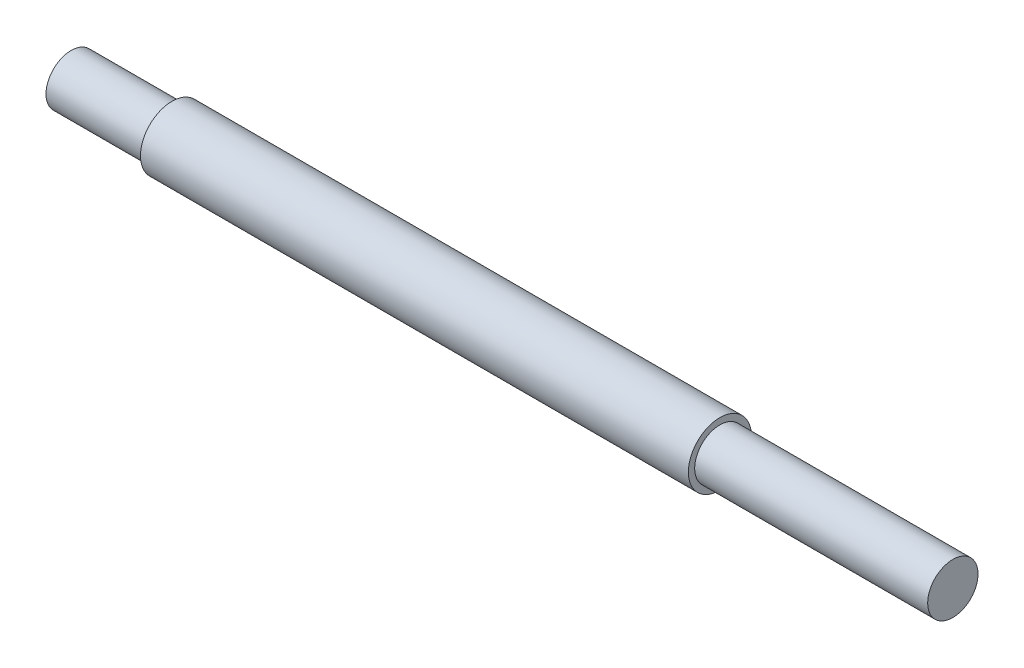
ISO-10303-21;
HEADER;
FILE_DESCRIPTION(('STEP AP214'),'2;1');
FILE_NAME('part.step','',(''),(''),'','','');
FILE_SCHEMA(('AUTOMOTIVE_DESIGN { 1 0 10303 214 1 1 1 1 }'));
ENDSEC;
DATA;
#1=APPLICATION_CONTEXT('core data for automotive mechanical design processes');
#2=APPLICATION_PROTOCOL_DEFINITION('international standard','automotive_design',2000,#1);
#3=PRODUCT_CONTEXT('',#1,'mechanical');
#4=PRODUCT('Part','Part','',(#3));
#5=PRODUCT_RELATED_PRODUCT_CATEGORY('part','',(#4));
#6=PRODUCT_DEFINITION_FORMATION('','',#4);
#7=PRODUCT_DEFINITION_CONTEXT('part definition',#1,'design');
#8=PRODUCT_DEFINITION('design','',#6,#7);
#9=PRODUCT_DEFINITION_SHAPE('','',#8);
#10=(LENGTH_UNIT() NAMED_UNIT(*) SI_UNIT(.MILLI.,.METRE.));
#11=(NAMED_UNIT(*) PLANE_ANGLE_UNIT() SI_UNIT($,.RADIAN.));
#12=(NAMED_UNIT(*) SI_UNIT($,.STERADIAN.) SOLID_ANGLE_UNIT());
#13=UNCERTAINTY_MEASURE_WITH_UNIT(LENGTH_MEASURE(1.E-05),#10,'distance_accuracy_value','');
#14=(GEOMETRIC_REPRESENTATION_CONTEXT(3) GLOBAL_UNCERTAINTY_ASSIGNED_CONTEXT((#13)) GLOBAL_UNIT_ASSIGNED_CONTEXT((#10,
#11,#12)) REPRESENTATION_CONTEXT('',''));
#15=CARTESIAN_POINT('',(0.,0.,0.));
#16=DIRECTION('',(0.,0.,1.));
#17=DIRECTION('',(1.,0.,0.));
#18=AXIS2_PLACEMENT_3D('',#15,#16,#17);
#19=CARTESIAN_POINT('',(0.,0.,-1.));
#20=DIRECTION('',(1.,0.,0.));
#21=DIRECTION('',(0.,0.,-1.));
#22=AXIS2_PLACEMENT_3D('',#19,#20,#21);
#23=PLANE('',#22);
#24=CARTESIAN_POINT('',(0.,0.,0.));
#25=DIRECTION('',(-1.,0.,0.));
#26=DIRECTION('',(0.,0.,1.));
#27=AXIS2_PLACEMENT_3D('',#24,#25,#26);
#28=CIRCLE('',#27,1.);
#29=CARTESIAN_POINT('',(0.,0.,1.));
#30=VERTEX_POINT('',#29);
#31=EDGE_CURVE('E56',#30,#30,#28,.T.);
#32=ORIENTED_EDGE('',*,*,#31,.T.);
#33=EDGE_LOOP('',(#32));
#34=FACE_BOUND('',#33,.T.);
#35=ADVANCED_FACE('F34',(#34),#23,.F.);
#36=CARTESIAN_POINT('',(35.,0.,0.));
#37=DIRECTION('',(-1.,0.,0.));
#38=DIRECTION('',(0.,0.,1.));
#39=AXIS2_PLACEMENT_3D('',#36,#37,#38);
#40=PLANE('',#39);
#41=CARTESIAN_POINT('',(35.,0.,0.));
#42=DIRECTION('',(-1.,0.,0.));
#43=DIRECTION('',(0.,0.,1.));
#44=AXIS2_PLACEMENT_3D('',#41,#42,#43);
#45=CIRCLE('',#44,1.);
#46=CARTESIAN_POINT('',(35.,0.,1.));
#47=VERTEX_POINT('',#46);
#48=EDGE_CURVE('E10',#47,#47,#45,.T.);
#49=ORIENTED_EDGE('',*,*,#48,.F.);
#50=EDGE_LOOP('',(#49));
#51=FACE_BOUND('',#50,.T.);
#52=ADVANCED_FACE('F86',(#51),#40,.F.);
#53=CARTESIAN_POINT('',(0.,0.,0.));
#54=DIRECTION('',(-1.,0.,0.));
#55=DIRECTION('',(0.,0.,1.));
#56=AXIS2_PLACEMENT_3D('',#53,#54,#55);
#57=CYLINDRICAL_SURFACE('',#56,1.);
#58=CARTESIAN_POINT('',(25.75,0.,0.));
#59=DIRECTION('',(-1.,0.,0.));
#60=DIRECTION('',(0.,0.,1.));
#61=AXIS2_PLACEMENT_3D('',#58,#59,#60);
#62=CIRCLE('',#61,0.999999999999999);
#63=CARTESIAN_POINT('',(25.75,0.,0.999999999999999));
#64=VERTEX_POINT('',#63);
#65=EDGE_CURVE('E40',#64,#64,#62,.T.);
#66=ORIENTED_EDGE('',*,*,#65,.F.);
#67=EDGE_LOOP('',(#66));
#68=FACE_BOUND('',#67,.T.);
#69=ORIENTED_EDGE('',*,*,#48,.T.);
#70=EDGE_LOOP('',(#69));
#71=FACE_BOUND('',#70,.T.);
#72=ADVANCED_FACE('F81',(#68,#71),#57,.T.);
#73=CARTESIAN_POINT('',(25.75,0.,-0.999999999999999));
#74=DIRECTION('',(-1.,0.,0.));
#75=DIRECTION('',(0.,0.,1.));
#76=AXIS2_PLACEMENT_3D('',#73,#74,#75);
#77=PLANE('',#76);
#78=CARTESIAN_POINT('',(25.75,0.,0.));
#79=DIRECTION('',(-1.,0.,0.));
#80=DIRECTION('',(0.,0.,1.));
#81=AXIS2_PLACEMENT_3D('',#78,#79,#80);
#82=CIRCLE('',#81,1.25);
#83=CARTESIAN_POINT('',(25.75,0.,1.25));
#84=VERTEX_POINT('',#83);
#85=EDGE_CURVE('E44',#84,#84,#82,.T.);
#86=ORIENTED_EDGE('',*,*,#85,.F.);
#87=EDGE_LOOP('',(#86));
#88=FACE_BOUND('',#87,.T.);
#89=ORIENTED_EDGE('',*,*,#65,.T.);
#90=EDGE_LOOP('',(#89));
#91=FACE_BOUND('',#90,.T.);
#92=ADVANCED_FACE('F76',(#88,#91),#77,.F.);
#93=CARTESIAN_POINT('',(0.,0.,0.));
#94=DIRECTION('',(-1.,0.,0.));
#95=DIRECTION('',(0.,0.,1.));
#96=AXIS2_PLACEMENT_3D('',#93,#94,#95);
#97=CYLINDRICAL_SURFACE('',#96,1.25);
#98=CARTESIAN_POINT('',(4.,0.,0.));
#99=DIRECTION('',(-1.,0.,0.));
#100=DIRECTION('',(0.,0.,1.));
#101=AXIS2_PLACEMENT_3D('',#98,#99,#100);
#102=CIRCLE('',#101,1.25);
#103=CARTESIAN_POINT('',(4.,0.,1.25));
#104=VERTEX_POINT('',#103);
#105=EDGE_CURVE('E48',#104,#104,#102,.T.);
#106=ORIENTED_EDGE('',*,*,#105,.F.);
#107=EDGE_LOOP('',(#106));
#108=FACE_BOUND('',#107,.T.);
#109=ORIENTED_EDGE('',*,*,#85,.T.);
#110=EDGE_LOOP('',(#109));
#111=FACE_BOUND('',#110,.T.);
#112=ADVANCED_FACE('F70',(#108,#111),#97,.T.);
#113=CARTESIAN_POINT('',(4.,0.,-1.25));
#114=DIRECTION('',(1.,0.,0.));
#115=DIRECTION('',(0.,0.,-1.));
#116=AXIS2_PLACEMENT_3D('',#113,#114,#115);
#117=PLANE('',#116);
#118=CARTESIAN_POINT('',(4.,0.,0.));
#119=DIRECTION('',(-1.,0.,0.));
#120=DIRECTION('',(0.,0.,1.));
#121=AXIS2_PLACEMENT_3D('',#118,#119,#120);
#122=CIRCLE('',#121,1.);
#123=CARTESIAN_POINT('',(4.,0.,1.));
#124=VERTEX_POINT('',#123);
#125=EDGE_CURVE('E53',#124,#124,#122,.T.);
#126=ORIENTED_EDGE('',*,*,#125,.F.);
#127=EDGE_LOOP('',(#126));
#128=FACE_BOUND('',#127,.T.);
#129=ORIENTED_EDGE('',*,*,#105,.T.);
#130=EDGE_LOOP('',(#129));
#131=FACE_BOUND('',#130,.T.);
#132=ADVANCED_FACE('F64',(#128,#131),#117,.F.);
#133=CARTESIAN_POINT('',(0.,0.,0.));
#134=DIRECTION('',(-1.,0.,0.));
#135=DIRECTION('',(0.,0.,1.));
#136=AXIS2_PLACEMENT_3D('',#133,#134,#135);
#137=CYLINDRICAL_SURFACE('',#136,1.);
#138=ORIENTED_EDGE('',*,*,#31,.F.);
#139=EDGE_LOOP('',(#138));
#140=FACE_BOUND('',#139,.T.);
#141=ORIENTED_EDGE('',*,*,#125,.T.);
#142=EDGE_LOOP('',(#141));
#143=FACE_BOUND('',#142,.T.);
#144=ADVANCED_FACE('F61',(#140,#143),#137,.T.);
#145=CLOSED_SHELL('',(#35,#52,#72,#92,#112,#132,#144));
#146=MANIFOLD_SOLID_BREP('B2',#145);
#147=ADVANCED_BREP_SHAPE_REPRESENTATION('',(#18,#146),#14);
#148=SHAPE_DEFINITION_REPRESENTATION(#9,#147);
ENDSEC;
END-ISO-10303-21;
